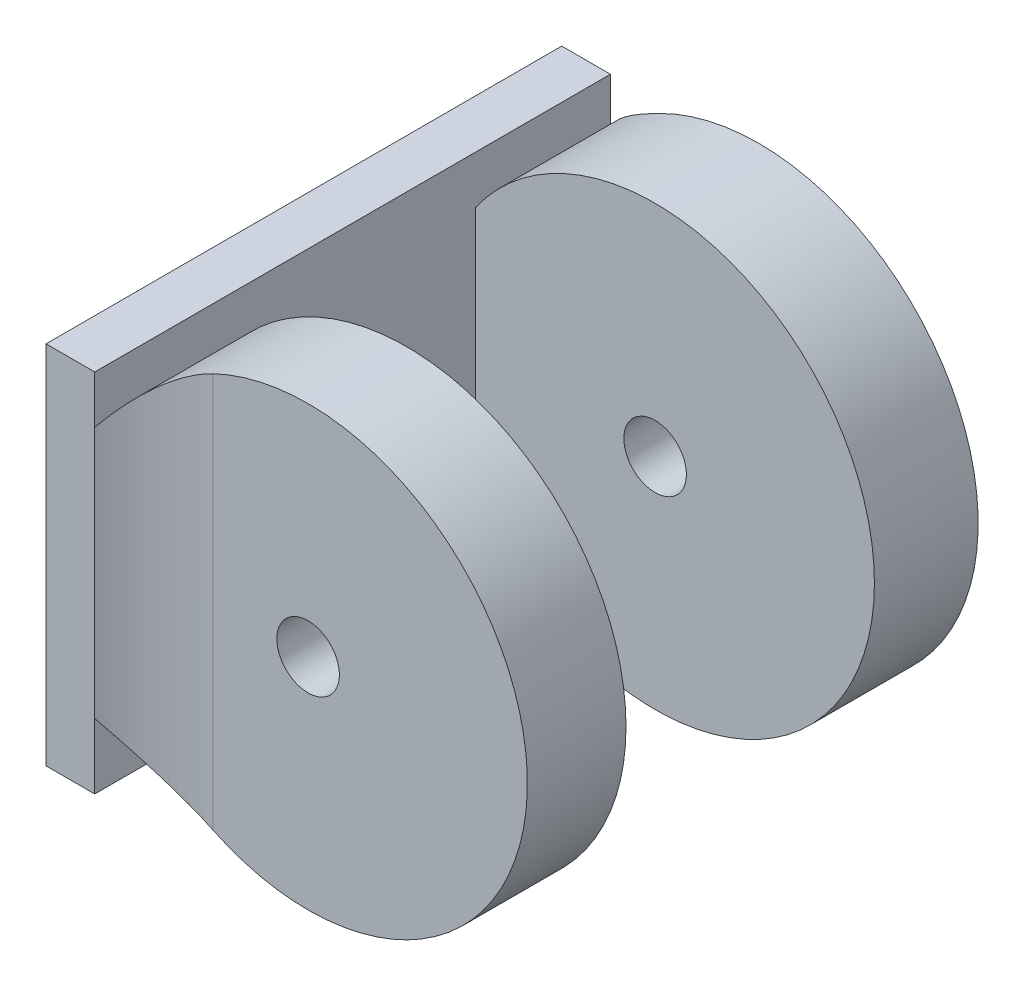
ISO-10303-21;
HEADER;
FILE_DESCRIPTION(('STEP AP214'),'2;1');
FILE_NAME('part.step','',(''),(''),'','','');
FILE_SCHEMA(('AUTOMOTIVE_DESIGN { 1 0 10303 214 1 1 1 1 }'));
ENDSEC;
DATA;
#1=APPLICATION_CONTEXT('core data for automotive mechanical design processes');
#2=APPLICATION_PROTOCOL_DEFINITION('international standard','automotive_design',2000,#1);
#3=PRODUCT_CONTEXT('',#1,'mechanical');
#4=PRODUCT('Part','Part','',(#3));
#5=PRODUCT_RELATED_PRODUCT_CATEGORY('part','',(#4));
#6=PRODUCT_DEFINITION_FORMATION('','',#4);
#7=PRODUCT_DEFINITION_CONTEXT('part definition',#1,'design');
#8=PRODUCT_DEFINITION('design','',#6,#7);
#9=PRODUCT_DEFINITION_SHAPE('','',#8);
#10=(LENGTH_UNIT() NAMED_UNIT(*) SI_UNIT(.MILLI.,.METRE.));
#11=(NAMED_UNIT(*) PLANE_ANGLE_UNIT() SI_UNIT($,.RADIAN.));
#12=(NAMED_UNIT(*) SI_UNIT($,.STERADIAN.) SOLID_ANGLE_UNIT());
#13=UNCERTAINTY_MEASURE_WITH_UNIT(LENGTH_MEASURE(1.E-05),#10,'distance_accuracy_value','');
#14=(GEOMETRIC_REPRESENTATION_CONTEXT(3) GLOBAL_UNCERTAINTY_ASSIGNED_CONTEXT((#13)) GLOBAL_UNIT_ASSIGNED_CONTEXT((#10,
#11,#12)) REPRESENTATION_CONTEXT('',''));
#15=CARTESIAN_POINT('',(0.,0.,0.));
#16=DIRECTION('',(0.,0.,1.));
#17=DIRECTION('',(1.,0.,0.));
#18=AXIS2_PLACEMENT_3D('',#15,#16,#17);
#19=CARTESIAN_POINT('',(174.,0.,0.));
#20=DIRECTION('',(1.,0.,0.));
#21=DIRECTION('',(0.,0.,-1.));
#22=AXIS2_PLACEMENT_3D('',#19,#20,#21);
#23=PLANE('',#22);
#24=DIRECTION('',(0.,-1.,0.));
#25=VECTOR('',#24,1.);
#26=CARTESIAN_POINT('',(174.,78.4462141903883,157.145809278735));
#27=LINE('',#26,#25);
#28=CARTESIAN_POINT('',(174.,78.4462141903883,157.145809278735));
#29=VERTEX_POINT('',#28);
#30=CARTESIAN_POINT('',(174.,74.5191696308053,157.145809278735));
#31=VERTEX_POINT('',#30);
#32=EDGE_CURVE('E126',#29,#31,#27,.T.);
#33=ORIENTED_EDGE('',*,*,#32,.T.);
#34=DIRECTION('',(0.,0.,-1.));
#35=VECTOR('',#34,1.);
#36=CARTESIAN_POINT('',(174.,74.5191696308053,154.356389087034));
#37=LINE('',#36,#35);
#38=CARTESIAN_POINT('',(174.,74.5191696308053,146.261075449589));
#39=VERTEX_POINT('',#38);
#40=EDGE_CURVE('E121',#39,#31,#37,.F.);
#41=ORIENTED_EDGE('',*,*,#40,.F.);
#42=DIRECTION('',(0.,1.,0.));
#43=VECTOR('',#42,1.);
#44=CARTESIAN_POINT('',(174.,0.,146.261075449589));
#45=LINE('',#44,#43);
#46=CARTESIAN_POINT('',(174.,53.812286242369,146.261075449589));
#47=VERTEX_POINT('',#46);
#48=EDGE_CURVE('E123',#47,#39,#45,.T.);
#49=ORIENTED_EDGE('',*,*,#48,.F.);
#50=DIRECTION('',(0.,0.,-1.));
#51=VECTOR('',#50,1.);
#52=CARTESIAN_POINT('',(174.,53.812286242369,154.356389087034));
#53=LINE('',#52,#51);
#54=CARTESIAN_POINT('',(174.,53.812286242369,157.145809278735));
#55=VERTEX_POINT('',#54);
#56=EDGE_CURVE('E131',#55,#47,#53,.T.);
#57=ORIENTED_EDGE('',*,*,#56,.F.);
#58=CARTESIAN_POINT('',(174.,48.4462141903883,157.145809278735));
#59=VERTEX_POINT('',#58);
#60=EDGE_CURVE('E162',#55,#59,#27,.T.);
#61=ORIENTED_EDGE('',*,*,#60,.T.);
#62=DIRECTION('',(0.,0.,-1.));
#63=VECTOR('',#62,1.);
#64=CARTESIAN_POINT('',(174.,48.4462141903883,157.145809278735));
#65=LINE('',#64,#63);
#66=CARTESIAN_POINT('',(174.,48.4462141903883,114.814520292912));
#67=VERTEX_POINT('',#66);
#68=EDGE_CURVE('E160',#59,#67,#65,.T.);
#69=ORIENTED_EDGE('',*,*,#68,.T.);
#70=DIRECTION('',(0.,1.,0.));
#71=VECTOR('',#70,1.);
#72=CARTESIAN_POINT('',(174.,78.4462141903883,114.814520292912));
#73=LINE('',#72,#71);
#74=CARTESIAN_POINT('',(174.,53.812286242369,114.814520292912));
#75=VERTEX_POINT('',#74);
#76=EDGE_CURVE('E166',#67,#75,#73,.T.);
#77=ORIENTED_EDGE('',*,*,#76,.T.);
#78=DIRECTION('',(0.,0.,-1.));
#79=VECTOR('',#78,1.);
#80=CARTESIAN_POINT('',(174.,53.812286242369,154.356389087034));
#81=LINE('',#80,#79);
#82=CARTESIAN_POINT('',(174.,53.812286242369,125.872112203177));
#83=VERTEX_POINT('',#82);
#84=EDGE_CURVE('E205',#75,#83,#81,.F.);
#85=ORIENTED_EDGE('',*,*,#84,.T.);
#86=DIRECTION('',(0.,1.,0.));
#87=VECTOR('',#86,1.);
#88=CARTESIAN_POINT('',(174.,91.7988652768922,125.872112203177));
#89=LINE('',#88,#87);
#90=CARTESIAN_POINT('',(174.,74.5191696308053,125.872112203177));
#91=VERTEX_POINT('',#90);
#92=EDGE_CURVE('E138',#83,#91,#89,.T.);
#93=ORIENTED_EDGE('',*,*,#92,.T.);
#94=DIRECTION('',(0.,0.,-1.));
#95=VECTOR('',#94,1.);
#96=CARTESIAN_POINT('',(174.,74.5191696308053,154.356389087034));
#97=LINE('',#96,#95);
#98=CARTESIAN_POINT('',(174.,74.5191696308053,114.814520292912));
#99=VERTEX_POINT('',#98);
#100=EDGE_CURVE('E202',#91,#99,#97,.T.);
#101=ORIENTED_EDGE('',*,*,#100,.T.);
#102=CARTESIAN_POINT('',(174.,78.4462141903883,114.814520292912));
#103=VERTEX_POINT('',#102);
#104=EDGE_CURVE('E165',#99,#103,#73,.T.);
#105=ORIENTED_EDGE('',*,*,#104,.T.);
#106=DIRECTION('',(0.,0.,1.));
#107=VECTOR('',#106,1.);
#108=CARTESIAN_POINT('',(174.,78.4462141903883,157.145809278735));
#109=LINE('',#108,#107);
#110=EDGE_CURVE('E170',#103,#29,#109,.T.);
#111=ORIENTED_EDGE('',*,*,#110,.T.);
#112=EDGE_LOOP('',(#33,#41,#49,#57,#61,#69,#77,#85,#93,#101,#105,#111));
#113=FACE_BOUND('',#112,.T.);
#114=ADVANCED_FACE('F39',(#113),#23,.T.);
#115=CARTESIAN_POINT('',(188.724341923646,64.1657279365871,154.356389087034));
#116=DIRECTION('',(0.,0.,-1.));
#117=DIRECTION('',(-1.,0.,0.));
#118=AXIS2_PLACEMENT_3D('',#115,#116,#117);
#119=CYLINDRICAL_SURFACE('',#118,18.);
#120=ORIENTED_EDGE('',*,*,#84,.F.);
#121=CARTESIAN_POINT('',(174.,53.812286242369,114.814520292912));
#122=CARTESIAN_POINT('',(174.219402504127,53.500271244139,115.010436192778));
#123=CARTESIAN_POINT('',(174.450795861187,53.1922609133334,115.199756209884));
#124=CARTESIAN_POINT('',(174.938339276933,52.5856647055216,115.562332677013));
#125=CARTESIAN_POINT('',(175.194526131911,52.2870937364612,115.735564479987));
#126=CARTESIAN_POINT('',(175.723666622732,51.7105751518627,116.057550477478));
#127=CARTESIAN_POINT('',(175.995881030487,51.4322770826634,116.206885561627));
#128=CARTESIAN_POINT('',(176.563620716559,50.8890151140998,116.48363622499));
#129=CARTESIAN_POINT('',(176.859134982271,50.6240450111687,116.611062070022));
#130=CARTESIAN_POINT('',(177.423877516848,50.1510000090344,116.821755146746));
#131=CARTESIAN_POINT('',(177.689741506772,49.9406071035661,116.908825895623));
#132=CARTESIAN_POINT('',(178.236762071944,49.5326479159225,117.062111527676));
#133=CARTESIAN_POINT('',(178.517912302389,49.3350763856018,117.128334987521));
#134=CARTESIAN_POINT('',(179.101754133089,48.9495803271402,117.238567390065));
#135=CARTESIAN_POINT('',(179.404812021882,48.7620297257539,117.281967505084));
#136=CARTESIAN_POINT('',(179.869086931224,48.493569336515,117.326155809659));
#137=CARTESIAN_POINT('',(180.025618822633,48.4061470753849,117.337400669218));
#138=CARTESIAN_POINT('',(180.341535336519,48.2358571849174,117.352518411243));
#139=CARTESIAN_POINT('',(180.500920617475,48.1529906253434,117.356389569347));
#140=CARTESIAN_POINT('',(180.661552290263,48.0725174636013,117.356389087034));
#141=B_SPLINE_CURVE_WITH_KNOTS('',3,(#121,#122,#123,#124,#125,#126,#127,#128,#129,#130,#131,
#132,#133,#134,#135,#136,#137,#138,#139,#140),.UNSPECIFIED.,.F.,.F.,(4,2,2,2,2,2,2,2,2,4),(0.,
1.28649459688828,2.57492866031077,3.82448324651679,5.07345073486339,6.12249431022289,
7.17110573854018,8.24642789745622,8.78515087534177,9.32399981977799),.UNSPECIFIED.);
#142=CARTESIAN_POINT('',(180.661552290263,48.0725174636013,117.356389087034));
#143=VERTEX_POINT('',#142);
#144=EDGE_CURVE('E54',#75,#143,#141,.T.);
#145=ORIENTED_EDGE('',*,*,#144,.T.);
#146=CARTESIAN_POINT('',(188.724341923646,64.1657279365871,117.356389087034));
#147=DIRECTION('',(0.,0.,-1.));
#148=DIRECTION('',(-1.,0.,0.));
#149=AXIS2_PLACEMENT_3D('',#146,#147,#148);
#150=CIRCLE('',#149,18.);
#151=CARTESIAN_POINT('',(180.661552290263,80.2589384095729,117.356389087034));
#152=VERTEX_POINT('',#151);
#153=EDGE_CURVE('E218',#152,#143,#150,.T.);
#154=ORIENTED_EDGE('',*,*,#153,.F.);
#155=CARTESIAN_POINT('',(180.661552290263,80.2589384095729,117.356389087034));
#156=CARTESIAN_POINT('',(180.506857897279,80.1814392842386,117.356389513913));
#157=CARTESIAN_POINT('',(180.35331762532,80.1017200798027,117.352799263272));
#158=CARTESIAN_POINT('',(180.048868923169,79.9380459005128,117.338765409974));
#159=CARTESIAN_POINT('',(179.89795994767,79.8540918176724,117.328323245053));
#160=CARTESIAN_POINT('',(179.450108458857,79.596444144543,117.287257829669));
#161=CARTESIAN_POINT('',(179.157480528113,79.4166838142545,117.246893254175));
#162=CARTESIAN_POINT('',(178.59285023709,79.0473947281307,117.144180922781));
#163=CARTESIAN_POINT('',(178.320520452735,78.8582066738437,117.082387542292));
#164=CARTESIAN_POINT('',(177.78995511168,78.4677463894018,116.939158038716));
#165=CARTESIAN_POINT('',(177.531725081032,78.2664694853056,116.857714280956));
#166=CARTESIAN_POINT('',(176.961914213733,77.7971649918127,116.653033643444));
#167=CARTESIAN_POINT('',(176.654934046355,77.525876018275,116.52445477754));
#168=CARTESIAN_POINT('',(176.065634898519,76.9689193508212,116.243693255093));
#169=CARTESIAN_POINT('',(175.783331367869,76.6832428229055,116.09149597443));
#170=CARTESIAN_POINT('',(175.234803909096,76.0905178822262,115.762102197364));
#171=CARTESIAN_POINT('',(174.969394612234,75.7830771386528,115.584256687176));
#172=CARTESIAN_POINT('',(174.591094190561,75.3143404643661,115.304601409371));
#173=CARTESIAN_POINT('',(174.468382197926,75.156954994831,115.209312575193));
#174=CARTESIAN_POINT('',(174.229395856237,74.8398053093059,115.014788241085));
#175=CARTESIAN_POINT('',(174.113120376889,74.6800415172578,114.915553439387));
#176=CARTESIAN_POINT('',(174.,74.5191696308053,114.814520292912));
#177=B_SPLINE_CURVE_WITH_KNOTS('',3,(#155,#156,#157,#158,#159,#160,#161,#162,#163,#164,#165,
#166,#167,#168,#169,#170,#171,#172,#173,#174,#175,#176),.UNSPECIFIED.,.F.,.F.,(4,2,2,2,2,2,2,2,
2,2,4),(0.,0.518942508052398,1.0377761614184,2.07356900278832,3.08435004056389,4.09552442669384,
5.3818217632906,6.66891875478571,7.99761656603524,8.66095632475788,9.32417922469446),.UNSPECIFIED.);
#178=EDGE_CURVE('E11',#152,#99,#177,.T.);
#179=ORIENTED_EDGE('',*,*,#178,.T.);
#180=ORIENTED_EDGE('',*,*,#100,.F.);
#181=CARTESIAN_POINT('',(188.724341923646,64.1657279365871,125.872112203177));
#182=DIRECTION('',(0.,0.,1.));
#183=DIRECTION('',(1.,0.,0.));
#184=AXIS2_PLACEMENT_3D('',#181,#182,#183);
#185=CIRCLE('',#184,18.);
#186=EDGE_CURVE('E214',#91,#83,#185,.F.);
#187=ORIENTED_EDGE('',*,*,#186,.T.);
#188=EDGE_LOOP('',(#120,#145,#154,#179,#180,#187));
#189=FACE_BOUND('',#188,.T.);
#190=ADVANCED_FACE('F258',(#189),#119,.T.);
#191=CARTESIAN_POINT('',(188.724341923646,64.1657279365871,117.356389087034));
#192=DIRECTION('',(0.,0.,-1.));
#193=DIRECTION('',(-1.,0.,0.));
#194=AXIS2_PLACEMENT_3D('',#191,#192,#193);
#195=PLANE('',#194);
#196=ORIENTED_EDGE('',*,*,#153,.T.);
#197=DIRECTION('',(0.,1.,0.));
#198=VECTOR('',#197,1.);
#199=CARTESIAN_POINT('',(180.661552290263,74.5191696308053,117.356389087034));
#200=LINE('',#199,#198);
#201=EDGE_CURVE('E66',#143,#152,#200,.T.);
#202=ORIENTED_EDGE('',*,*,#201,.T.);
#203=EDGE_LOOP('',(#196,#202));
#204=FACE_BOUND('',#203,.T.);
#205=CARTESIAN_POINT('',(188.724341923646,64.1657279365871,117.356389087034));
#206=DIRECTION('',(0.,0.,-1.));
#207=DIRECTION('',(-1.,0.,0.));
#208=AXIS2_PLACEMENT_3D('',#205,#206,#207);
#209=CIRCLE('',#208,2.56681782022819);
#210=CARTESIAN_POINT('',(186.157524103417,64.1657279365871,117.356389087034));
#211=VERTEX_POINT('',#210);
#212=EDGE_CURVE('E209',#211,#211,#209,.T.);
#213=ORIENTED_EDGE('',*,*,#212,.F.);
#214=EDGE_LOOP('',(#213));
#215=FACE_BOUND('',#214,.T.);
#216=ADVANCED_FACE('F284',(#204,#215),#195,.T.);
#217=CARTESIAN_POINT('',(219.744830205902,91.7988652768922,125.872112203177));
#218=DIRECTION('',(0.,0.,1.));
#219=DIRECTION('',(1.,0.,0.));
#220=AXIS2_PLACEMENT_3D('',#217,#218,#219);
#221=PLANE('',#220);
#222=ORIENTED_EDGE('',*,*,#92,.F.);
#223=ORIENTED_EDGE('',*,*,#186,.F.);
#224=EDGE_LOOP('',(#222,#223));
#225=FACE_BOUND('',#224,.T.);
#226=CARTESIAN_POINT('',(188.724341923646,64.1657279365871,125.872112203177));
#227=DIRECTION('',(0.,0.,1.));
#228=DIRECTION('',(1.,0.,0.));
#229=AXIS2_PLACEMENT_3D('',#226,#227,#228);
#230=CIRCLE('',#229,2.56681782022819);
#231=CARTESIAN_POINT('',(191.291159743874,64.1657279365871,125.872112203177));
#232=VERTEX_POINT('',#231);
#233=EDGE_CURVE('E213',#232,#232,#230,.T.);
#234=ORIENTED_EDGE('',*,*,#233,.F.);
#235=EDGE_LOOP('',(#234));
#236=FACE_BOUND('',#235,.T.);
#237=ADVANCED_FACE('F282',(#225,#236),#221,.T.);
#238=CARTESIAN_POINT('',(188.724341923646,64.1657279365871,157.356389087034));
#239=DIRECTION('',(0.,0.,-1.));
#240=DIRECTION('',(-1.,0.,0.));
#241=AXIS2_PLACEMENT_3D('',#238,#239,#240);
#242=CYLINDRICAL_SURFACE('',#241,2.56681782022819);
#243=ORIENTED_EDGE('',*,*,#233,.T.);
#244=EDGE_LOOP('',(#243));
#245=FACE_BOUND('',#244,.T.);
#246=ORIENTED_EDGE('',*,*,#212,.T.);
#247=EDGE_LOOP('',(#246));
#248=FACE_BOUND('',#247,.T.);
#249=ADVANCED_FACE('F278',(#245,#248),#242,.F.);
#250=CARTESIAN_POINT('',(174.,78.4462141903883,157.145809278735));
#251=DIRECTION('',(0.,0.,-1.));
#252=DIRECTION('',(-1.,0.,0.));
#253=AXIS2_PLACEMENT_3D('',#250,#251,#252);
#254=PLANE('',#253);
#255=DIRECTION('',(0.,-1.,0.));
#256=VECTOR('',#255,1.);
#257=CARTESIAN_POINT('',(170.,78.4462141903883,157.145809278735));
#258=LINE('',#257,#256);
#259=CARTESIAN_POINT('',(170.,78.4462141903883,157.145809278735));
#260=VERTEX_POINT('',#259);
#261=CARTESIAN_POINT('',(170.,48.4462141903883,157.145809278735));
#262=VERTEX_POINT('',#261);
#263=EDGE_CURVE('E149',#260,#262,#258,.T.);
#264=ORIENTED_EDGE('',*,*,#263,.T.);
#265=DIRECTION('',(-1.,0.,0.));
#266=VECTOR('',#265,1.);
#267=CARTESIAN_POINT('',(174.,48.4462141903883,157.145809278735));
#268=LINE('',#267,#266);
#269=EDGE_CURVE('E198',#59,#262,#268,.T.);
#270=ORIENTED_EDGE('',*,*,#269,.F.);
#271=ORIENTED_EDGE('',*,*,#60,.F.);
#272=EDGE_CURVE('E161',#31,#55,#27,.T.);
#273=ORIENTED_EDGE('',*,*,#272,.F.);
#274=ORIENTED_EDGE('',*,*,#32,.F.);
#275=DIRECTION('',(-1.,0.,0.));
#276=VECTOR('',#275,1.);
#277=CARTESIAN_POINT('',(174.,78.4462141903883,157.145809278735));
#278=LINE('',#277,#276);
#279=EDGE_CURVE('E174',#29,#260,#278,.T.);
#280=ORIENTED_EDGE('',*,*,#279,.T.);
#281=EDGE_LOOP('',(#264,#270,#271,#273,#274,#280));
#282=FACE_BOUND('',#281,.T.);
#283=ADVANCED_FACE('F274',(#282),#254,.F.);
#284=CARTESIAN_POINT('',(174.,48.4462141903883,157.145809278735));
#285=DIRECTION('',(0.,1.,0.));
#286=DIRECTION('',(0.,0.,1.));
#287=AXIS2_PLACEMENT_3D('',#284,#285,#286);
#288=PLANE('',#287);
#289=DIRECTION('',(0.,0.,-1.));
#290=VECTOR('',#289,1.);
#291=CARTESIAN_POINT('',(170.,48.4462141903883,157.145809278735));
#292=LINE('',#291,#290);
#293=CARTESIAN_POINT('',(170.,48.4462141903883,114.814520292912));
#294=VERTEX_POINT('',#293);
#295=EDGE_CURVE('E178',#262,#294,#292,.T.);
#296=ORIENTED_EDGE('',*,*,#295,.T.);
#297=DIRECTION('',(-1.,0.,0.));
#298=VECTOR('',#297,1.);
#299=CARTESIAN_POINT('',(174.,48.4462141903883,114.814520292912));
#300=LINE('',#299,#298);
#301=EDGE_CURVE('E194',#67,#294,#300,.T.);
#302=ORIENTED_EDGE('',*,*,#301,.F.);
#303=ORIENTED_EDGE('',*,*,#68,.F.);
#304=ORIENTED_EDGE('',*,*,#269,.T.);
#305=EDGE_LOOP('',(#296,#302,#303,#304));
#306=FACE_BOUND('',#305,.T.);
#307=ADVANCED_FACE('F270',(#306),#288,.F.);
#308=CARTESIAN_POINT('',(174.,78.4462141903883,114.814520292912));
#309=DIRECTION('',(0.,0.,1.));
#310=DIRECTION('',(0.,-1.,0.));
#311=AXIS2_PLACEMENT_3D('',#308,#309,#310);
#312=PLANE('',#311);
#313=DIRECTION('',(0.,1.,0.));
#314=VECTOR('',#313,1.);
#315=CARTESIAN_POINT('',(170.,78.4462141903883,114.814520292912));
#316=LINE('',#315,#314);
#317=CARTESIAN_POINT('',(170.,78.4462141903883,114.814520292912));
#318=VERTEX_POINT('',#317);
#319=EDGE_CURVE('E181',#294,#318,#316,.T.);
#320=ORIENTED_EDGE('',*,*,#319,.T.);
#321=DIRECTION('',(-1.,0.,0.));
#322=VECTOR('',#321,1.);
#323=CARTESIAN_POINT('',(174.,78.4462141903883,114.814520292912));
#324=LINE('',#323,#322);
#325=EDGE_CURVE('E190',#103,#318,#324,.T.);
#326=ORIENTED_EDGE('',*,*,#325,.F.);
#327=ORIENTED_EDGE('',*,*,#104,.F.);
#328=EDGE_CURVE('E171',#75,#99,#73,.T.);
#329=ORIENTED_EDGE('',*,*,#328,.F.);
#330=ORIENTED_EDGE('',*,*,#76,.F.);
#331=ORIENTED_EDGE('',*,*,#301,.T.);
#332=EDGE_LOOP('',(#320,#326,#327,#329,#330,#331));
#333=FACE_BOUND('',#332,.T.);
#334=ADVANCED_FACE('F266',(#333),#312,.F.);
#335=CARTESIAN_POINT('',(174.,78.4462141903883,157.145809278735));
#336=DIRECTION('',(0.,-1.,0.));
#337=DIRECTION('',(0.,0.,-1.));
#338=AXIS2_PLACEMENT_3D('',#335,#336,#337);
#339=PLANE('',#338);
#340=DIRECTION('',(0.,0.,1.));
#341=VECTOR('',#340,1.);
#342=CARTESIAN_POINT('',(170.,78.4462141903883,157.145809278735));
#343=LINE('',#342,#341);
#344=EDGE_CURVE('E184',#318,#260,#343,.T.);
#345=ORIENTED_EDGE('',*,*,#344,.T.);
#346=ORIENTED_EDGE('',*,*,#279,.F.);
#347=ORIENTED_EDGE('',*,*,#110,.F.);
#348=ORIENTED_EDGE('',*,*,#325,.T.);
#349=EDGE_LOOP('',(#345,#346,#347,#348));
#350=FACE_BOUND('',#349,.T.);
#351=ADVANCED_FACE('F262',(#350),#339,.F.);
#352=CARTESIAN_POINT('',(170.,0.,0.));
#353=DIRECTION('',(1.,0.,0.));
#354=DIRECTION('',(0.,0.,-1.));
#355=AXIS2_PLACEMENT_3D('',#352,#353,#354);
#356=PLANE('',#355);
#357=ORIENTED_EDGE('',*,*,#263,.F.);
#358=ORIENTED_EDGE('',*,*,#344,.F.);
#359=ORIENTED_EDGE('',*,*,#319,.F.);
#360=ORIENTED_EDGE('',*,*,#295,.F.);
#361=EDGE_LOOP('',(#357,#358,#359,#360));
#362=FACE_BOUND('',#361,.T.);
#363=ADVANCED_FACE('F259',(#362),#356,.F.);
#364=CARTESIAN_POINT('',(188.724341923646,64.1657279365871,154.356389087034));
#365=DIRECTION('',(0.,0.,-1.));
#366=DIRECTION('',(-1.,0.,0.));
#367=AXIS2_PLACEMENT_3D('',#364,#365,#366);
#368=PLANE('',#367);
#369=CARTESIAN_POINT('',(188.724341923646,64.1657279365871,154.356389087034));
#370=DIRECTION('',(0.,0.,-1.));
#371=DIRECTION('',(-1.,0.,0.));
#372=AXIS2_PLACEMENT_3D('',#369,#370,#371);
#373=CIRCLE('',#372,18.);
#374=CARTESIAN_POINT('',(180.928747276973,80.3900523941652,154.356389087034));
#375=VERTEX_POINT('',#374);
#376=CARTESIAN_POINT('',(180.928747276973,47.9414034790091,154.356389087034));
#377=VERTEX_POINT('',#376);
#378=EDGE_CURVE('E143',#375,#377,#373,.T.);
#379=ORIENTED_EDGE('',*,*,#378,.F.);
#380=DIRECTION('',(0.,1.,0.));
#381=VECTOR('',#380,1.);
#382=CARTESIAN_POINT('',(180.928747276973,64.1657279365871,154.356389087034));
#383=LINE('',#382,#381);
#384=EDGE_CURVE('E229',#375,#377,#383,.F.);
#385=ORIENTED_EDGE('',*,*,#384,.T.);
#386=EDGE_LOOP('',(#379,#385));
#387=FACE_BOUND('',#386,.T.);
#388=CARTESIAN_POINT('',(188.724341923646,64.1657279365871,154.356389087034));
#389=DIRECTION('',(0.,0.,-1.));
#390=DIRECTION('',(-1.,0.,0.));
#391=AXIS2_PLACEMENT_3D('',#388,#389,#390);
#392=CIRCLE('',#391,2.56681782022819);
#393=CARTESIAN_POINT('',(186.157524103417,64.1657279365871,154.356389087034));
#394=VERTEX_POINT('',#393);
#395=EDGE_CURVE('E144',#394,#394,#392,.T.);
#396=ORIENTED_EDGE('',*,*,#395,.T.);
#397=EDGE_LOOP('',(#396));
#398=FACE_BOUND('',#397,.T.);
#399=ADVANCED_FACE('F253',(#387,#398),#368,.F.);
#400=CARTESIAN_POINT('',(188.724341923646,64.1657279365871,154.356389087034));
#401=DIRECTION('',(0.,0.,-1.));
#402=DIRECTION('',(-1.,0.,0.));
#403=AXIS2_PLACEMENT_3D('',#400,#401,#402);
#404=CYLINDRICAL_SURFACE('',#403,18.);
#405=ORIENTED_EDGE('',*,*,#40,.T.);
#406=CARTESIAN_POINT('',(174.,74.5191696308053,157.145809278735));
#407=CARTESIAN_POINT('',(174.108022586741,74.6727930037636,157.042014726307));
#408=CARTESIAN_POINT('',(174.219012376668,74.8255319365712,156.940025954653));
#409=CARTESIAN_POINT('',(174.447041147389,75.129064126768,156.73992535411));
#410=CARTESIAN_POINT('',(174.564081027505,75.2798570907099,156.641814105446));
#411=CARTESIAN_POINT('',(174.924659723118,75.7293091163503,156.353531594668));
#412=CARTESIAN_POINT('',(175.177422975362,76.024706148548,156.169638659377));
#413=CARTESIAN_POINT('',(175.699542439896,76.5955111031002,155.827037159031));
#414=CARTESIAN_POINT('',(175.968131073799,76.8712553141831,155.667720232876));
#415=CARTESIAN_POINT('',(176.528752658003,77.410300194263,155.370812127899));
#416=CARTESIAN_POINT('',(176.820778203684,77.6736047519837,155.233214127675));
#417=CARTESIAN_POINT('',(177.401252984857,78.1628291053951,154.994420626807));
#418=CARTESIAN_POINT('',(177.687765256887,78.3900015503212,154.891089762766));
#419=CARTESIAN_POINT('',(178.279139631956,78.8297421391457,154.708840545138));
#420=CARTESIAN_POINT('',(178.583992524556,79.0423175005452,154.629910058229));
#421=CARTESIAN_POINT('',(179.058313540095,79.3514105022463,154.531493154683));
#422=CARTESIAN_POINT('',(179.221664116651,79.4541736553568,154.501750285623));
#423=CARTESIAN_POINT('',(179.552505348254,79.6549122855258,154.450129467651));
#424=CARTESIAN_POINT('',(179.719995709428,79.7528881009644,154.428250962171));
#425=CARTESIAN_POINT('',(180.05910903573,79.9439304265735,154.392812959201));
#426=CARTESIAN_POINT('',(180.230740209537,80.0369857757661,154.3792716902));
#427=CARTESIAN_POINT('',(180.577358039071,80.2176734296447,154.361056273279));
#428=CARTESIAN_POINT('',(180.752345692425,80.3053040882123,154.356384804259));
#429=CARTESIAN_POINT('',(180.928747276973,80.3900523941652,154.356389087034));
#430=B_SPLINE_CURVE_WITH_KNOTS('',3,(#406,#407,#408,#409,#410,#411,#412,#413,#414,#415,#416,
#417,#418,#419,#420,#421,#422,#423,#424,#425,#426,#427,#428,#429),.UNSPECIFIED.,.F.,.F.,(4,2,2,
2,2,2,2,2,2,2,2,4),(0.,0.643663014770438,1.28742198404852,2.57634055431927,3.82489255258167,
5.07305162646842,6.21162795172062,7.34963719477188,7.93521451138982,8.52075037800668,
9.10756195266206,9.69455073070842),.UNSPECIFIED.);
#431=EDGE_CURVE('E234',#31,#375,#430,.T.);
#432=ORIENTED_EDGE('',*,*,#431,.T.);
#433=ORIENTED_EDGE('',*,*,#378,.T.);
#434=CARTESIAN_POINT('',(180.928747276973,47.9414034790091,154.356389087034));
#435=CARTESIAN_POINT('',(180.774897438461,48.015322935773,154.356388562676));
#436=CARTESIAN_POINT('',(180.622134891897,48.0914213221065,154.359939845961));
#437=CARTESIAN_POINT('',(180.31910588812,48.2477804355953,154.373837376526));
#438=CARTESIAN_POINT('',(180.168838929758,48.3280403133873,154.384182242219));
#439=CARTESIAN_POINT('',(179.722705925898,48.5745195386308,154.424897796362));
#440=CARTESIAN_POINT('',(179.430952279261,48.7467056886433,154.464951696553));
#441=CARTESIAN_POINT('',(178.867843155219,49.1006257709482,154.566980176141));
#442=CARTESIAN_POINT('',(178.596158696472,49.2820090394275,154.62837598026));
#443=CARTESIAN_POINT('',(178.066389342298,49.6566491072786,154.770869872195));
#444=CARTESIAN_POINT('',(177.808309936795,49.8499106326682,154.85197584053));
#445=CARTESIAN_POINT('',(177.207962923409,50.3247930528318,155.066955989846));
#446=CARTESIAN_POINT('',(176.872469876722,50.6112899062597,155.209041303952));
#447=CARTESIAN_POINT('',(176.230251771059,51.2008498918739,155.521691613398));
#448=CARTESIAN_POINT('',(175.923553478451,51.5039280312015,155.692282705012));
#449=CARTESIAN_POINT('',(175.328314085567,52.1348758477454,156.064056036235));
#450=CARTESIAN_POINT('',(175.040869579745,52.4632481772676,156.266138763456));
#451=CARTESIAN_POINT('',(174.633101934196,52.9638006873777,156.584996821827));
#452=CARTESIAN_POINT('',(174.501203570717,53.131806030207,156.693784584099));
#453=CARTESIAN_POINT('',(174.244971935018,53.4702684683906,156.916235138822));
#454=CARTESIAN_POINT('',(174.120636998988,53.6407250142512,157.029896849648));
#455=CARTESIAN_POINT('',(174.,53.812286242369,157.145809278735));
#456=B_SPLINE_CURVE_WITH_KNOTS('',3,(#434,#435,#436,#437,#438,#439,#440,#441,#442,#443,#444,
#445,#446,#447,#448,#449,#450,#451,#452,#453,#454,#455),.UNSPECIFIED.,.F.,.F.,(4,2,2,2,2,2,2,2,
2,2,4),(0.,0.511939736374826,1.02377539366896,2.04560524949204,3.04164494368172,
4.03808353159785,5.42612599989099,6.81544621635056,8.25633805406498,8.9752987215933,
9.69410065514983),.UNSPECIFIED.);
#457=EDGE_CURVE('E242',#377,#55,#456,.T.);
#458=ORIENTED_EDGE('',*,*,#457,.T.);
#459=ORIENTED_EDGE('',*,*,#56,.T.);
#460=CARTESIAN_POINT('',(188.724341923646,64.1657279365871,146.261075449589));
#461=DIRECTION('',(0.,0.,-1.));
#462=DIRECTION('',(-1.,0.,0.));
#463=AXIS2_PLACEMENT_3D('',#460,#461,#462);
#464=CIRCLE('',#463,18.);
#465=EDGE_CURVE('E136',#47,#39,#464,.F.);
#466=ORIENTED_EDGE('',*,*,#465,.T.);
#467=EDGE_LOOP('',(#405,#432,#433,#458,#459,#466));
#468=FACE_BOUND('',#467,.T.);
#469=ADVANCED_FACE('F140',(#468),#404,.T.);
#470=CARTESIAN_POINT('',(219.744830205902,91.7988652768922,146.261075449589));
#471=DIRECTION('',(0.,0.,-1.));
#472=DIRECTION('',(-1.,0.,0.));
#473=AXIS2_PLACEMENT_3D('',#470,#471,#472);
#474=PLANE('',#473);
#475=CARTESIAN_POINT('',(188.724341923646,64.1657279365871,146.261075449589));
#476=DIRECTION('',(0.,0.,-1.));
#477=DIRECTION('',(-1.,0.,0.));
#478=AXIS2_PLACEMENT_3D('',#475,#476,#477);
#479=CIRCLE('',#478,2.56681782022819);
#480=CARTESIAN_POINT('',(186.157524103417,64.1657279365871,146.261075449589));
#481=VERTEX_POINT('',#480);
#482=EDGE_CURVE('E152',#481,#481,#479,.T.);
#483=ORIENTED_EDGE('',*,*,#482,.F.);
#484=EDGE_LOOP('',(#483));
#485=FACE_BOUND('',#484,.T.);
#486=ORIENTED_EDGE('',*,*,#465,.F.);
#487=ORIENTED_EDGE('',*,*,#48,.T.);
#488=EDGE_LOOP('',(#486,#487));
#489=FACE_BOUND('',#488,.T.);
#490=ADVANCED_FACE('F135',(#485,#489),#474,.T.);
#491=CARTESIAN_POINT('',(188.724341923646,64.1657279365871,157.356389087034));
#492=DIRECTION('',(0.,0.,-1.));
#493=DIRECTION('',(-1.,0.,0.));
#494=AXIS2_PLACEMENT_3D('',#491,#492,#493);
#495=CYLINDRICAL_SURFACE('',#494,2.56681782022819);
#496=ORIENTED_EDGE('',*,*,#482,.T.);
#497=EDGE_LOOP('',(#496));
#498=FACE_BOUND('',#497,.T.);
#499=ORIENTED_EDGE('',*,*,#395,.F.);
#500=EDGE_LOOP('',(#499));
#501=FACE_BOUND('',#500,.T.);
#502=ADVANCED_FACE('F334',(#498,#501),#495,.F.);
#503=CARTESIAN_POINT('',(180.928747276973,0.,164.356389087034));
#504=DIRECTION('',(0.,1.,0.));
#505=DIRECTION('',(0.,0.,1.));
#506=AXIS2_PLACEMENT_3D('',#503,#504,#505);
#507=CYLINDRICAL_SURFACE('',#506,10.);
#508=ORIENTED_EDGE('',*,*,#457,.F.);
#509=ORIENTED_EDGE('',*,*,#384,.F.);
#510=ORIENTED_EDGE('',*,*,#431,.F.);
#511=ORIENTED_EDGE('',*,*,#272,.T.);
#512=EDGE_LOOP('',(#508,#509,#510,#511));
#513=FACE_BOUND('',#512,.T.);
#514=ADVANCED_FACE('F247',(#513),#507,.F.);
#515=CARTESIAN_POINT('',(180.661552290263,0.,107.356389087034));
#516=DIRECTION('',(0.,-1.,0.));
#517=DIRECTION('',(0.,0.,-1.));
#518=AXIS2_PLACEMENT_3D('',#515,#516,#517);
#519=CYLINDRICAL_SURFACE('',#518,10.);
#520=ORIENTED_EDGE('',*,*,#178,.F.);
#521=ORIENTED_EDGE('',*,*,#201,.F.);
#522=ORIENTED_EDGE('',*,*,#144,.F.);
#523=ORIENTED_EDGE('',*,*,#328,.T.);
#524=EDGE_LOOP('',(#520,#521,#522,#523));
#525=FACE_BOUND('',#524,.T.);
#526=ADVANCED_FACE('F41',(#525),#519,.F.);
#527=CLOSED_SHELL('',(#114,#190,#216,#237,#249,#283,#307,#334,#351,#363,#399,#469,#490,#502,
#514,#526));
#528=MANIFOLD_SOLID_BREP('B2',#527);
#529=ADVANCED_BREP_SHAPE_REPRESENTATION('',(#18,#528),#14);
#530=SHAPE_DEFINITION_REPRESENTATION(#9,#529);
ENDSEC;
END-ISO-10303-21;
